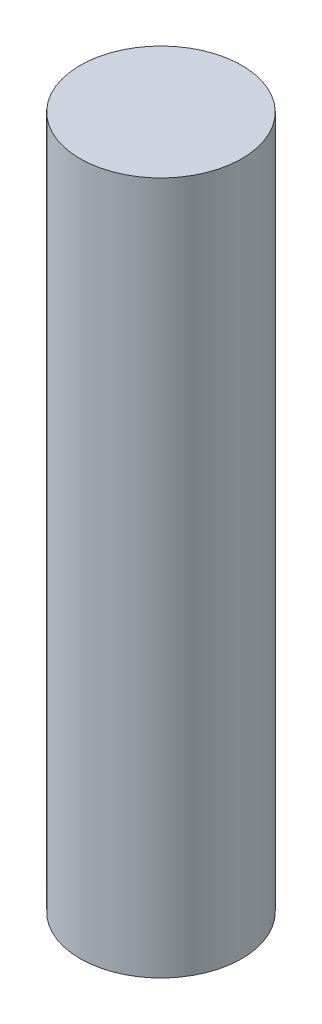
ISO-10303-21;
HEADER;
FILE_DESCRIPTION(('STEP AP214'),'2;1');
FILE_NAME('part.step','',(''),(''),'','','');
FILE_SCHEMA(('AUTOMOTIVE_DESIGN { 1 0 10303 214 1 1 1 1 }'));
ENDSEC;
DATA;
#1=APPLICATION_CONTEXT('core data for automotive mechanical design processes');
#2=APPLICATION_PROTOCOL_DEFINITION('international standard','automotive_design',2000,#1);
#3=PRODUCT_CONTEXT('',#1,'mechanical');
#4=PRODUCT('Part','Part','',(#3));
#5=PRODUCT_RELATED_PRODUCT_CATEGORY('part','',(#4));
#6=PRODUCT_DEFINITION_FORMATION('','',#4);
#7=PRODUCT_DEFINITION_CONTEXT('part definition',#1,'design');
#8=PRODUCT_DEFINITION('design','',#6,#7);
#9=PRODUCT_DEFINITION_SHAPE('','',#8);
#10=(LENGTH_UNIT() NAMED_UNIT(*) SI_UNIT(.MILLI.,.METRE.));
#11=(NAMED_UNIT(*) PLANE_ANGLE_UNIT() SI_UNIT($,.RADIAN.));
#12=(NAMED_UNIT(*) SI_UNIT($,.STERADIAN.) SOLID_ANGLE_UNIT());
#13=UNCERTAINTY_MEASURE_WITH_UNIT(LENGTH_MEASURE(1.E-05),#10,'distance_accuracy_value','');
#14=(GEOMETRIC_REPRESENTATION_CONTEXT(3) GLOBAL_UNCERTAINTY_ASSIGNED_CONTEXT((#13)) GLOBAL_UNIT_ASSIGNED_CONTEXT((#10,
#11,#12)) REPRESENTATION_CONTEXT('',''));
#15=CARTESIAN_POINT('',(0.,0.,0.));
#16=DIRECTION('',(0.,0.,1.));
#17=DIRECTION('',(1.,0.,0.));
#18=AXIS2_PLACEMENT_3D('',#15,#16,#17);
#19=CARTESIAN_POINT('',(0.,50.,0.));
#20=DIRECTION('',(0.,1.,0.));
#21=DIRECTION('',(0.,0.,1.));
#22=AXIS2_PLACEMENT_3D('',#19,#20,#21);
#23=CYLINDRICAL_SURFACE('',#22,35.);
#24=CARTESIAN_POINT('',(0.,300.,0.));
#25=DIRECTION('',(0.,1.,0.));
#26=DIRECTION('',(0.,0.,1.));
#27=AXIS2_PLACEMENT_3D('',#24,#25,#26);
#28=CIRCLE('',#27,35.);
#29=CARTESIAN_POINT('',(0.,300.,35.));
#30=VERTEX_POINT('',#29);
#31=EDGE_CURVE('E52',#30,#30,#28,.T.);
#32=ORIENTED_EDGE('',*,*,#31,.F.);
#33=EDGE_LOOP('',(#32));
#34=FACE_BOUND('',#33,.T.);
#35=CARTESIAN_POINT('',(0.,0.,0.));
#36=DIRECTION('',(0.,1.,0.));
#37=DIRECTION('',(0.,0.,1.));
#38=AXIS2_PLACEMENT_3D('',#35,#36,#37);
#39=CIRCLE('',#38,35.);
#40=CARTESIAN_POINT('',(0.,0.,35.));
#41=VERTEX_POINT('',#40);
#42=EDGE_CURVE('E10',#41,#41,#39,.T.);
#43=ORIENTED_EDGE('',*,*,#42,.T.);
#44=EDGE_LOOP('',(#43));
#45=FACE_BOUND('',#44,.T.);
#46=CARTESIAN_POINT('',(-10.,25.,-33.5410196624969));
#47=CARTESIAN_POINT('',(-9.99999923943393,24.7253565987537,-33.5410201992862));
#48=CARTESIAN_POINT('',(-9.98867606575019,24.4506994048518,-33.5444021363806));
#49=CARTESIAN_POINT('',(-9.94348425866187,23.9034012047106,-33.557825731312));
#50=CARTESIAN_POINT('',(-9.90961410570279,23.6307603356139,-33.5678678380112));
#51=CARTESIAN_POINT('',(-9.81961797450427,23.089391873077,-33.5943045622518));
#52=CARTESIAN_POINT('',(-9.76348407483999,22.8206657078049,-33.6107014407688));
#53=CARTESIAN_POINT('',(-9.6294520159476,22.2891369773045,-33.6493463571708));
#54=CARTESIAN_POINT('',(-9.55155411669808,22.026334341358,-33.6715943251624));
#55=CARTESIAN_POINT('',(-9.37479910448403,21.508903174997,-33.7212328436465));
#56=CARTESIAN_POINT('',(-9.27597915155492,21.2542610617943,-33.7486142667736));
#57=CARTESIAN_POINT('',(-9.05803263826671,20.7542427264201,-33.8077622767824));
#58=CARTESIAN_POINT('',(-8.93889858444173,20.5088699644748,-33.8395304810347));
#59=CARTESIAN_POINT('',(-8.68124206203328,20.0290666453522,-33.9065442661613));
#60=CARTESIAN_POINT('',(-8.54272197507523,19.7946347487712,-33.9417894197265));
#61=CARTESIAN_POINT('',(-8.24723434602685,19.338104016859,-34.0147950055007));
#62=CARTESIAN_POINT('',(-8.090265863283,19.1160058112535,-34.0525555659236));
#63=CARTESIAN_POINT('',(-7.7546048709643,18.6798915559011,-34.1305808420949));
#64=CARTESIAN_POINT('',(-7.57545404484594,18.4662352056343,-34.170885123872));
#65=CARTESIAN_POINT('',(-7.19999478580579,18.054665720137,-34.251962754991));
#66=CARTESIAN_POINT('',(-7.0036861086903,17.8567528090468,-34.2927361110016));
#67=CARTESIAN_POINT('',(-6.59513723687238,17.4779137949104,-34.3736457919725));
#68=CARTESIAN_POINT('',(-6.38289495997761,17.2969899189577,-34.4137820328418));
#69=CARTESIAN_POINT('',(-5.94384830597081,16.9533624514775,-34.4923236506202));
#70=CARTESIAN_POINT('',(-5.71704434175755,16.7906583436843,-34.5307290765542));
#71=CARTESIAN_POINT('',(-5.24589871717487,16.4817026409496,-34.6054691038345));
#72=CARTESIAN_POINT('',(-5.00130689562593,16.3358194011109,-34.6417509595107));
#73=CARTESIAN_POINT('',(-4.50023789710562,16.0652986297037,-34.7103985859168));
#74=CARTESIAN_POINT('',(-4.2437653758627,15.9406528638315,-34.7427658730045));
#75=CARTESIAN_POINT('',(-3.72061541891931,15.71354002502,-34.8026771023564));
#76=CARTESIAN_POINT('',(-3.45393745468338,15.6110741025993,-34.8302207943955));
#77=CARTESIAN_POINT('',(-2.91232107561406,15.4292119669154,-34.8796834683892));
#78=CARTESIAN_POINT('',(-2.63738291528027,15.3498150436906,-34.9016026234397));
#79=CARTESIAN_POINT('',(-2.0885672944864,15.2165684569736,-34.9386826521512));
#80=CARTESIAN_POINT('',(-1.81484942639095,15.1621061185139,-34.9540049794983));
#81=CARTESIAN_POINT('',(-1.26354144205871,15.0762261972747,-34.9782730447546));
#82=CARTESIAN_POINT('',(-0.985951386999631,15.0448082508299,-34.9872188832917));
#83=CARTESIAN_POINT('',(-0.429027749130409,15.0053086907045,-34.9984784701866));
#84=CARTESIAN_POINT('',(-0.149694462673904,14.9972232132236,-35.0007933166201));
#85=CARTESIAN_POINT('',(0.408641816258123,15.0044532003309,-34.9987277265144));
#86=CARTESIAN_POINT('',(0.687644814112342,15.0197682784491,-34.9943474005488));
#87=CARTESIAN_POINT('',(1.23515784053591,15.0728739132974,-34.9792397154471));
#88=CARTESIAN_POINT('',(1.50373774700617,15.1100007199904,-34.9686998445269));
#89=CARTESIAN_POINT('',(2.03670384563232,15.2058616730634,-34.941709060937));
#90=CARTESIAN_POINT('',(2.30109013269278,15.2645953297353,-34.9252582822351));
#91=CARTESIAN_POINT('',(2.82381948161548,15.403169893922,-34.8868846549169));
#92=CARTESIAN_POINT('',(3.08216340315882,15.4830077786906,-34.8649625899747));
#93=CARTESIAN_POINT('',(3.59122516021103,15.6631892867644,-34.8162105136581));
#94=CARTESIAN_POINT('',(3.84194009097107,15.7635406110757,-34.7893786594842));
#95=CARTESIAN_POINT('',(4.33666969561683,15.9851484686398,-34.7311963461476));
#96=CARTESIAN_POINT('',(4.58058391320967,16.106617290416,-34.6998005905425));
#97=CARTESIAN_POINT('',(5.05734276799435,16.3688179706728,-34.6335273931315));
#98=CARTESIAN_POINT('',(5.29018684638013,16.5095508001872,-34.5986497758407));
#99=CARTESIAN_POINT('',(5.74340125100719,16.8093241268322,-34.5263090576622));
#100=CARTESIAN_POINT('',(5.96376958726055,16.9683675324518,-34.4888455464054));
#101=CARTESIAN_POINT('',(6.39066970392855,17.3037009506409,-34.4122997982213));
#102=CARTESIAN_POINT('',(6.5972011681299,17.4799913571288,-34.3732175243335));
#103=CARTESIAN_POINT('',(7.0021880140222,17.8551968645079,-34.2930526893021));
#104=CARTESIAN_POINT('',(7.20010450632117,18.0546893405514,-34.2519480998279));
#105=CARTESIAN_POINT('',(7.57849520182946,18.4696663087614,-34.1702192925668));
#106=CARTESIAN_POINT('',(7.75896961996977,18.6851506038101,-34.1295950688659));
#107=CARTESIAN_POINT('',(8.10132677211669,19.1308025167372,-34.0499546392467));
#108=CARTESIAN_POINT('',(8.26320392956362,19.3609745068412,-34.0109389178896));
#109=CARTESIAN_POINT('',(8.56710954476448,19.8343714788608,-33.9356617944146));
#110=CARTESIAN_POINT('',(8.70914570411853,20.0775913450109,-33.8993993260865));
#111=CARTESIAN_POINT('',(8.97347330027555,20.5776245245342,-33.8303946097299));
#112=CARTESIAN_POINT('',(9.09559271116304,20.8345331973057,-33.7976837718125));
#113=CARTESIAN_POINT('',(9.31767539200051,21.358318939295,-33.7371336023622));
#114=CARTESIAN_POINT('',(9.41763845443788,21.6251961018487,-33.709294316456));
#115=CARTESIAN_POINT('',(9.59452639566767,22.1669389094316,-33.6593748681741));
#116=CARTESIAN_POINT('',(9.67145677044556,22.4418026315334,-33.6372933320655));
#117=CARTESIAN_POINT('',(9.80160754454035,22.997521301808,-33.5995995630494));
#118=CARTESIAN_POINT('',(9.8548287931643,23.2783760349934,-33.5839870984086));
#119=CARTESIAN_POINT('',(9.93565594606216,23.8342708304313,-33.5601616869136));
#120=CARTESIAN_POINT('',(9.96407237790455,24.1091832404242,-33.551714878982));
#121=CARTESIAN_POINT('',(9.99805219418053,24.6605393238799,-33.5416050759296));
#122=CARTESIAN_POINT('',(10.0036160954347,24.9369829625717,-33.5399419273932));
#123=CARTESIAN_POINT('',(9.99184034780525,25.4893052345236,-33.5434518569622));
#124=CARTESIAN_POINT('',(9.97450330046127,25.7651839283958,-33.5486241585629));
#125=CARTESIAN_POINT('',(9.91709091617231,26.3143543667096,-33.5656401935583));
#126=CARTESIAN_POINT('',(9.87701573818624,26.5876461292226,-33.5774838803144));
#127=CARTESIAN_POINT('',(9.77567915809122,27.123367713533,-33.607124367067));
#128=CARTESIAN_POINT('',(9.71492934555664,27.3859025531028,-33.6247771035844));
#129=CARTESIAN_POINT('',(9.57256102543982,27.904911675211,-33.6655841318637));
#130=CARTESIAN_POINT('',(9.49093503634264,28.1613837489289,-33.6887403957455));
#131=CARTESIAN_POINT('',(9.30749659302216,28.6664247047087,-33.739880888404));
#132=CARTESIAN_POINT('',(9.20568941567636,28.9149956330501,-33.7678638548704));
#133=CARTESIAN_POINT('',(8.9825948674385,29.4028355055378,-33.8278927785026));
#134=CARTESIAN_POINT('',(8.86130002196634,29.6421008365685,-33.8599402936465));
#135=CARTESIAN_POINT('',(8.59693013091352,30.1154727521168,-33.9280395428965));
#136=CARTESIAN_POINT('',(8.4533970367148,30.3493122584578,-33.9641697194119));
#137=CARTESIAN_POINT('',(8.14774216839361,30.8042601338834,-34.038787400789));
#138=CARTESIAN_POINT('',(7.98561203232733,31.0253627083026,-34.0772759624195));
#139=CARTESIAN_POINT('',(7.64384747368883,31.4534191053329,-34.1555606749632));
#140=CARTESIAN_POINT('',(7.46420973975092,31.6603702387133,-34.1953570722918));
#141=CARTESIAN_POINT('',(7.08867051783362,32.0587287192906,-34.2751743716915));
#142=CARTESIAN_POINT('',(6.89277593190081,32.250142595432,-34.3151951718283));
#143=CARTESIAN_POINT('',(6.47888206853384,32.6226126923105,-34.3957851138339));
#144=CARTESIAN_POINT('',(6.26035551492953,32.8030896578212,-34.4363260927693));
#145=CARTESIAN_POINT('',(5.80862563123668,33.1449413837777,-34.5153939300818));
#146=CARTESIAN_POINT('',(5.57542772907472,33.3063231459153,-34.5539215238013));
#147=CARTESIAN_POINT('',(5.09572436736378,33.6089513994419,-34.6279150591104));
#148=CARTESIAN_POINT('',(4.84921406074908,33.7501904877737,-34.6633798731542));
#149=CARTESIAN_POINT('',(4.34472846041853,34.0113246765861,-34.7302179651174));
#150=CARTESIAN_POINT('',(4.08675792584358,34.1312285353947,-34.7615929205442));
#151=CARTESIAN_POINT('',(3.56303209887874,34.3479683403698,-34.8191566919847));
#152=CARTESIAN_POINT('',(3.29734986438355,34.4449708456765,-34.8453827044689));
#153=CARTESIAN_POINT('',(2.7582632876867,34.616234503212,-34.8921936038076));
#154=CARTESIAN_POINT('',(2.48485895562919,34.6904956853134,-34.9127784980723));
#155=CARTESIAN_POINT('',(1.93241017844306,34.8155990905264,-34.9477091430746));
#156=CARTESIAN_POINT('',(1.65336695227035,34.8664463196635,-34.9620562274521));
#157=CARTESIAN_POINT('',(1.09171365958664,34.9442712956776,-34.9840982946887));
#158=CARTESIAN_POINT('',(0.809103699697788,34.9712497543694,-34.9917934759208));
#159=CARTESIAN_POINT('',(0.252462084131194,35.000559797146,-35.0001573187687));
#160=CARTESIAN_POINT('',(-0.0215225513272927,35.0037231283591,-35.0010630963484));
#161=CARTESIAN_POINT('',(-0.568768883543378,34.9875638742855,-34.9964479738474));
#162=CARTESIAN_POINT('',(-0.842030598167421,34.9682418500102,-34.9909272341089));
#163=CARTESIAN_POINT('',(-1.38583535326668,34.9072861505987,-34.9736110214422));
#164=CARTESIAN_POINT('',(-1.65637853405986,34.8656536331146,-34.9618158740823));
#165=CARTESIAN_POINT('',(-2.19283017136798,34.7604410457071,-34.9322725193019));
#166=CARTESIAN_POINT('',(-2.458738608187,34.6968608825383,-34.9145242865896));
#167=CARTESIAN_POINT('',(-2.98165821193156,34.5489721373291,-34.8737418337707));
#168=CARTESIAN_POINT('',(-3.23872858450435,34.4648588595037,-34.8507575473881));
#169=CARTESIAN_POINT('',(-3.74489266568276,34.2762466106849,-34.800007231243));
#170=CARTESIAN_POINT('',(-3.99398346847017,34.1717403094946,-34.7722394825046));
#171=CARTESIAN_POINT('',(-4.48248170432188,33.9431579285943,-34.7126476385437));
#172=CARTESIAN_POINT('',(-4.72188994298112,33.8190834811913,-34.6808238817019));
#173=CARTESIAN_POINT('',(-5.18958184588027,33.5522356103247,-34.6139286395569));
#174=CARTESIAN_POINT('',(-5.41786490285217,33.4094611676871,-34.5788569772693));
#175=CARTESIAN_POINT('',(-5.86853397113376,33.1016643005632,-34.5052746695351));
#176=CARTESIAN_POINT('',(-6.09054294599142,32.9361066775567,-34.4666927858993));
#177=CARTESIAN_POINT('',(-6.51992039889811,32.5873019116465,-34.3880544304596));
#178=CARTESIAN_POINT('',(-6.72728862045331,32.4040544589648,-34.3479979328403));
#179=CARTESIAN_POINT('',(-7.12614815443181,32.0210032369391,-34.2674689061437));
#180=CARTESIAN_POINT('',(-7.31763512224942,31.8211949667763,-34.2269962666045));
#181=CARTESIAN_POINT('',(-7.68345411659888,31.4063264052752,-34.146736421132));
#182=CARTESIAN_POINT('',(-7.85778643153596,31.1912663704552,-34.1069492036846));
#183=CARTESIAN_POINT('',(-8.19254839714507,30.7413278801249,-34.0281135221844));
#184=CARTESIAN_POINT('',(-8.35248651731939,30.5060750133751,-33.9891126599732));
#185=CARTESIAN_POINT('',(-8.65187712802938,30.0225344403465,-33.9141392284172));
#186=CARTESIAN_POINT('',(-8.79133706818808,29.7742515190254,-33.8781655598728));
#187=CARTESIAN_POINT('',(-9.04873375864626,29.2663166544722,-33.8103258761863));
#188=CARTESIAN_POINT('',(-9.16667661481195,29.0066679624985,-33.778458696509));
#189=CARTESIAN_POINT('',(-9.38011072605112,28.4777611631818,-33.7198129801321));
#190=CARTESIAN_POINT('',(-9.47560457557733,28.2085041704258,-33.6930338554698));
#191=CARTESIAN_POINT('',(-9.63217171968068,27.6986372891073,-33.6485804920449));
#192=CARTESIAN_POINT('',(-9.69613238055121,27.4589736791345,-33.6301693020325));
#193=CARTESIAN_POINT('',(-9.80613540501045,26.9751610978291,-33.5982588457961));
#194=CARTESIAN_POINT('',(-9.85217247767413,26.7310108243022,-33.584761030044));
#195=CARTESIAN_POINT('',(-9.92595998535747,26.2397594926423,-33.5630272904321));
#196=CARTESIAN_POINT('',(-9.95371266668255,25.9926588007782,-33.5547907202125));
#197=CARTESIAN_POINT('',(-9.99072994313014,25.4970421717581,-33.543787573157));
#198=CARTESIAN_POINT('',(-10.0000006882416,25.248526732983,-33.5410191767524));
#199=CARTESIAN_POINT('',(-10.,25.,-33.5410196624969));
#200=B_SPLINE_CURVE_WITH_KNOTS('',3,(#46,#47,#48,#49,#50,#51,#52,#53,#54,#55,#56,#57,#58,#59,
#60,#61,#62,#63,#64,#65,#66,#67,#68,#69,#70,#71,#72,#73,#74,#75,#76,#77,#78,#79,#80,#81,#82,#83,
#84,#85,#86,#87,#88,#89,#90,#91,#92,#93,#94,#95,#96,#97,#98,#99,#100,#101,#102,#103,#104,#105,
#106,#107,#108,#109,#110,#111,#112,#113,#114,#115,#116,#117,#118,#119,#120,#121,#122,#123,#124,
#125,#126,#127,#128,#129,#130,#131,#132,#133,#134,#135,#136,#137,#138,#139,#140,#141,#142,#143,
#144,#145,#146,#147,#148,#149,#150,#151,#152,#153,#154,#155,#156,#157,#158,#159,#160,#161,#162,
#163,#164,#165,#166,#167,#168,#169,#170,#171,#172,#173,#174,#175,#176,#177,#178,#179,#180,#181,
#182,#183,#184,#185,#186,#187,#188,#189,#190,#191,#192,#193,#194,#195,#196,#197,#198,#199),
.UNSPECIFIED.,.T.,.F.,(4,2,2,2,2,2,2,2,2,2,2,2,2,2,2,2,2,2,2,2,2,2,2,2,2,2,2,2,2,2,2,2,2,2,2,2,
2,2,2,2,2,2,2,2,2,2,2,2,2,2,2,2,2,2,2,2,2,2,2,2,2,2,2,2,2,2,2,2,2,2,2,2,2,2,2,2,4),(0.,
0.823701047760434,1.64745761450443,2.47150753654054,3.29554761543278,4.11813619924581,
4.94102887859512,5.7638205520025,6.58665419642648,7.43085740850722,8.27507263740162,
9.11939838047033,9.9637001931242,10.8239325239474,11.6838305582612,12.5437731867495,
13.4036893472143,14.2411626012325,15.0786226387379,15.915943986932,16.7532515065588,
17.566310037649,18.3793501423217,19.1922738587792,20.0055033194671,20.8274383245668,
21.6494147759068,22.4715219722572,23.2936479497759,24.1446658633096,24.9956732887877,
25.846935234275,26.6978658251586,27.555795965154,28.413734140038,29.2714674330295,
30.1291699978733,30.9576666225657,31.7861445103174,32.6145282913652,33.4429062813767,
34.2521198575801,35.0616238436492,35.8709164431464,36.6805201946621,37.5098183779317,
38.3394909180949,39.1693206871764,39.998799926782,40.8566875964613,41.7142597207966,
42.5721462216683,43.4296797348486,44.2807698766978,45.1318589005646,45.9827658725606,
46.8336474679393,47.6546676233018,48.475667294582,49.2966243697632,50.1175849328533,
50.9310218536438,51.7447517017076,52.5584137071114,53.3721200766205,54.2100155993227,
55.0479257976172,55.8860644705246,56.7241890501773,57.5845487346958,58.4445946550489,
59.3043961407342,60.1640982094517,60.9095909280826,61.6553035446949,62.4009245306496,
63.1462973647524),.UNSPECIFIED.);
#201=CARTESIAN_POINT('',(-10.,25.,-33.5410196624969));
#202=VERTEX_POINT('',#201);
#203=EDGE_CURVE('E42',#202,#202,#200,.T.);
#204=ORIENTED_EDGE('',*,*,#203,.T.);
#205=EDGE_LOOP('',(#204));
#206=FACE_BOUND('',#205,.T.);
#207=ADVANCED_FACE('F38',(#34,#45,#206),#23,.T.);
#208=CARTESIAN_POINT('',(0.,0.,0.));
#209=DIRECTION('',(0.,-1.,0.));
#210=DIRECTION('',(0.,0.,-1.));
#211=AXIS2_PLACEMENT_3D('',#208,#209,#210);
#212=PLANE('',#211);
#213=ORIENTED_EDGE('',*,*,#42,.F.);
#214=EDGE_LOOP('',(#213));
#215=FACE_BOUND('',#214,.T.);
#216=ADVANCED_FACE('F40',(#215),#212,.T.);
#217=CARTESIAN_POINT('',(-35.,300.,0.));
#218=DIRECTION('',(0.,1.,0.));
#219=DIRECTION('',(0.,0.,1.));
#220=AXIS2_PLACEMENT_3D('',#217,#218,#219);
#221=PLANE('',#220);
#222=ORIENTED_EDGE('',*,*,#31,.T.);
#223=EDGE_LOOP('',(#222));
#224=FACE_BOUND('',#223,.T.);
#225=ADVANCED_FACE('F80',(#224),#221,.T.);
#226=CARTESIAN_POINT('',(0.,25.,-22.));
#227=DIRECTION('',(0.,0.,-1.));
#228=DIRECTION('',(-1.,0.,0.));
#229=AXIS2_PLACEMENT_3D('',#226,#227,#228);
#230=CYLINDRICAL_SURFACE('',#229,10.);
#231=ORIENTED_EDGE('',*,*,#203,.F.);
#232=EDGE_LOOP('',(#231));
#233=FACE_BOUND('',#232,.T.);
#234=CARTESIAN_POINT('',(0.,25.,-22.));
#235=DIRECTION('',(0.,0.,1.));
#236=DIRECTION('',(1.,0.,0.));
#237=AXIS2_PLACEMENT_3D('',#234,#235,#236);
#238=CIRCLE('',#237,10.);
#239=CARTESIAN_POINT('',(10.,25.,-22.));
#240=VERTEX_POINT('',#239);
#241=EDGE_CURVE('E67',#240,#240,#238,.T.);
#242=ORIENTED_EDGE('',*,*,#241,.T.);
#243=EDGE_LOOP('',(#242));
#244=FACE_BOUND('',#243,.T.);
#245=ADVANCED_FACE('F77',(#233,#244),#230,.F.);
#246=CARTESIAN_POINT('',(0.,25.,-22.));
#247=DIRECTION('',(0.,0.,1.));
#248=DIRECTION('',(1.,0.,0.));
#249=AXIS2_PLACEMENT_3D('',#246,#247,#248);
#250=PLANE('',#249);
#251=ORIENTED_EDGE('',*,*,#241,.F.);
#252=EDGE_LOOP('',(#251));
#253=FACE_BOUND('',#252,.T.);
#254=ADVANCED_FACE('F79',(#253),#250,.F.);
#255=CLOSED_SHELL('',(#207,#216,#225,#245,#254));
#256=CARTESIAN_POINT('',(0.,280.,0.));
#257=DIRECTION('',(0.,-1.,0.));
#258=DIRECTION('',(0.,0.,-1.));
#259=AXIS2_PLACEMENT_3D('',#256,#257,#258);
#260=PLANE('',#259);
#261=CARTESIAN_POINT('',(0.,280.,0.));
#262=DIRECTION('',(0.,1.,0.));
#263=DIRECTION('',(0.,0.,1.));
#264=AXIS2_PLACEMENT_3D('',#261,#262,#263);
#265=CIRCLE('',#264,30.);
#266=CARTESIAN_POINT('',(0.,280.,30.));
#267=VERTEX_POINT('',#266);
#268=EDGE_CURVE('E57',#267,#267,#265,.T.);
#269=ORIENTED_EDGE('',*,*,#268,.F.);
#270=EDGE_LOOP('',(#269));
#271=FACE_BOUND('',#270,.T.);
#272=ADVANCED_FACE('F100',(#271),#260,.T.);
#273=CARTESIAN_POINT('',(0.,50.,0.));
#274=DIRECTION('',(0.,1.,0.));
#275=DIRECTION('',(0.,0.,1.));
#276=AXIS2_PLACEMENT_3D('',#273,#274,#275);
#277=CYLINDRICAL_SURFACE('',#276,30.);
#278=ORIENTED_EDGE('',*,*,#268,.T.);
#279=EDGE_LOOP('',(#278));
#280=FACE_BOUND('',#279,.T.);
#281=CARTESIAN_POINT('',(0.,50.,0.));
#282=DIRECTION('',(0.,1.,0.));
#283=DIRECTION('',(0.,0.,1.));
#284=AXIS2_PLACEMENT_3D('',#281,#282,#283);
#285=CIRCLE('',#284,30.);
#286=CARTESIAN_POINT('',(0.,50.,30.));
#287=VERTEX_POINT('',#286);
#288=EDGE_CURVE('E63',#287,#287,#285,.T.);
#289=ORIENTED_EDGE('',*,*,#288,.F.);
#290=EDGE_LOOP('',(#289));
#291=FACE_BOUND('',#290,.T.);
#292=ADVANCED_FACE('F103',(#280,#291),#277,.F.);
#293=CARTESIAN_POINT('',(-30.,50.,0.));
#294=DIRECTION('',(0.,1.,0.));
#295=DIRECTION('',(0.,0.,1.));
#296=AXIS2_PLACEMENT_3D('',#293,#294,#295);
#297=PLANE('',#296);
#298=ORIENTED_EDGE('',*,*,#288,.T.);
#299=EDGE_LOOP('',(#298));
#300=FACE_BOUND('',#299,.T.);
#301=ADVANCED_FACE('F107',(#300),#297,.T.);
#302=CLOSED_SHELL('',(#272,#292,#301));
#303=ORIENTED_CLOSED_SHELL('',*,#302,.T.);
#304=BREP_WITH_VOIDS('B2',#255,(#303));
#305=ADVANCED_BREP_SHAPE_REPRESENTATION('',(#18,#304),#14);
#306=SHAPE_DEFINITION_REPRESENTATION(#9,#305);
ENDSEC;
END-ISO-10303-21;
